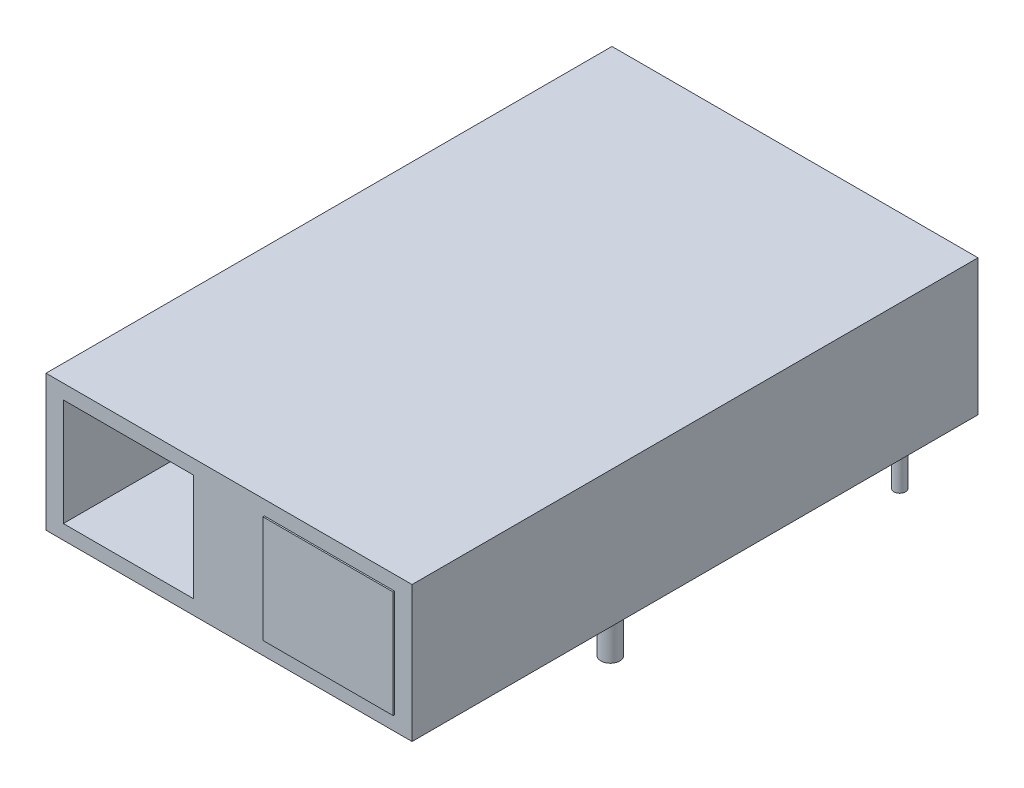
ISO-10303-21;
HEADER;
FILE_DESCRIPTION(('STEP AP214'),'2;1');
FILE_NAME('part.step','',(''),(''),'','','');
FILE_SCHEMA(('AUTOMOTIVE_DESIGN { 1 0 10303 214 1 1 1 1 }'));
ENDSEC;
DATA;
#1=APPLICATION_CONTEXT('core data for automotive mechanical design processes');
#2=APPLICATION_PROTOCOL_DEFINITION('international standard','automotive_design',2000,#1);
#3=PRODUCT_CONTEXT('',#1,'mechanical');
#4=PRODUCT('Part','Part','',(#3));
#5=PRODUCT_RELATED_PRODUCT_CATEGORY('part','',(#4));
#6=PRODUCT_DEFINITION_FORMATION('','',#4);
#7=PRODUCT_DEFINITION_CONTEXT('part definition',#1,'design');
#8=PRODUCT_DEFINITION('design','',#6,#7);
#9=PRODUCT_DEFINITION_SHAPE('','',#8);
#10=(LENGTH_UNIT() NAMED_UNIT(*) SI_UNIT(.MILLI.,.METRE.));
#11=(NAMED_UNIT(*) PLANE_ANGLE_UNIT() SI_UNIT($,.RADIAN.));
#12=(NAMED_UNIT(*) SI_UNIT($,.STERADIAN.) SOLID_ANGLE_UNIT());
#13=UNCERTAINTY_MEASURE_WITH_UNIT(LENGTH_MEASURE(1.E-05),#10,'distance_accuracy_value','');
#14=(GEOMETRIC_REPRESENTATION_CONTEXT(3) GLOBAL_UNCERTAINTY_ASSIGNED_CONTEXT((#13)) GLOBAL_UNIT_ASSIGNED_CONTEXT((#10,
#11,#12)) REPRESENTATION_CONTEXT('',''));
#15=CARTESIAN_POINT('',(0.,0.,0.));
#16=DIRECTION('',(0.,0.,1.));
#17=DIRECTION('',(1.,0.,0.));
#18=AXIS2_PLACEMENT_3D('',#15,#16,#17);
#19=CARTESIAN_POINT('',(0.,-4.7,0.));
#20=DIRECTION('',(0.,1.,0.));
#21=DIRECTION('',(0.,0.,1.));
#22=AXIS2_PLACEMENT_3D('',#19,#20,#21);
#23=PLANE('',#22);
#24=DIRECTION('',(0.,0.,1.));
#25=VECTOR('',#24,1.);
#26=CARTESIAN_POINT('',(-12.65,-4.7,-19.56));
#27=LINE('',#26,#25);
#28=CARTESIAN_POINT('',(-12.65,-4.7,-19.56));
#29=VERTEX_POINT('',#28);
#30=CARTESIAN_POINT('',(-12.65,-4.7,19.56));
#31=VERTEX_POINT('',#30);
#32=EDGE_CURVE('E195',#29,#31,#27,.T.);
#33=ORIENTED_EDGE('',*,*,#32,.F.);
#34=DIRECTION('',(-1.,0.,0.));
#35=VECTOR('',#34,1.);
#36=CARTESIAN_POINT('',(-12.65,-4.7,-19.56));
#37=LINE('',#36,#35);
#38=CARTESIAN_POINT('',(12.65,-4.7,-19.56));
#39=VERTEX_POINT('',#38);
#40=EDGE_CURVE('E204',#39,#29,#37,.T.);
#41=ORIENTED_EDGE('',*,*,#40,.F.);
#42=DIRECTION('',(0.,0.,-1.));
#43=VECTOR('',#42,1.);
#44=CARTESIAN_POINT('',(12.65,-4.7,-19.56));
#45=LINE('',#44,#43);
#46=CARTESIAN_POINT('',(12.65,-4.7,19.56));
#47=VERTEX_POINT('',#46);
#48=EDGE_CURVE('E201',#47,#39,#45,.T.);
#49=ORIENTED_EDGE('',*,*,#48,.F.);
#50=DIRECTION('',(1.,0.,0.));
#51=VECTOR('',#50,1.);
#52=CARTESIAN_POINT('',(-12.65,-4.7,19.56));
#53=LINE('',#52,#51);
#54=EDGE_CURVE('E198',#31,#47,#53,.T.);
#55=ORIENTED_EDGE('',*,*,#54,.F.);
#56=EDGE_LOOP('',(#33,#41,#49,#55));
#57=FACE_BOUND('',#56,.T.);
#58=CARTESIAN_POINT('',(-10.16,-4.7,3.35999999999999));
#59=DIRECTION('',(0.,1.,0.));
#60=DIRECTION('',(0.,0.,1.));
#61=AXIS2_PLACEMENT_3D('',#58,#59,#60);
#62=CIRCLE('',#61,0.649999999999999);
#63=CARTESIAN_POINT('',(-10.16,-4.7,4.00999999999999));
#64=VERTEX_POINT('',#63);
#65=EDGE_CURVE('E210',#64,#64,#62,.F.);
#66=ORIENTED_EDGE('',*,*,#65,.F.);
#67=EDGE_LOOP('',(#66));
#68=FACE_BOUND('',#67,.T.);
#69=CARTESIAN_POINT('',(10.16,-4.7,3.35999999999999));
#70=DIRECTION('',(0.,1.,0.));
#71=DIRECTION('',(0.,0.,1.));
#72=AXIS2_PLACEMENT_3D('',#69,#70,#71);
#73=CIRCLE('',#72,0.649999999999999);
#74=CARTESIAN_POINT('',(10.16,-4.7,4.00999999999999));
#75=VERTEX_POINT('',#74);
#76=EDGE_CURVE('E218',#75,#75,#73,.F.);
#77=ORIENTED_EDGE('',*,*,#76,.F.);
#78=EDGE_LOOP('',(#77));
#79=FACE_BOUND('',#78,.T.);
#80=CARTESIAN_POINT('',(-10.16,-4.7,-16.64));
#81=DIRECTION('',(0.,1.,0.));
#82=DIRECTION('',(0.,0.,1.));
#83=AXIS2_PLACEMENT_3D('',#80,#81,#82);
#84=CIRCLE('',#83,0.4);
#85=CARTESIAN_POINT('',(-10.16,-4.7,-16.24));
#86=VERTEX_POINT('',#85);
#87=EDGE_CURVE('E221',#86,#86,#84,.F.);
#88=ORIENTED_EDGE('',*,*,#87,.F.);
#89=EDGE_LOOP('',(#88));
#90=FACE_BOUND('',#89,.T.);
#91=CARTESIAN_POINT('',(-7.62,-4.7,-16.64));
#92=DIRECTION('',(0.,1.,0.));
#93=DIRECTION('',(0.,0.,1.));
#94=AXIS2_PLACEMENT_3D('',#91,#92,#93);
#95=CIRCLE('',#94,0.4);
#96=CARTESIAN_POINT('',(-7.62,-4.7,-16.24));
#97=VERTEX_POINT('',#96);
#98=EDGE_CURVE('E224',#97,#97,#95,.F.);
#99=ORIENTED_EDGE('',*,*,#98,.F.);
#100=EDGE_LOOP('',(#99));
#101=FACE_BOUND('',#100,.T.);
#102=CARTESIAN_POINT('',(-5.08,-4.7,-16.64));
#103=DIRECTION('',(0.,1.,0.));
#104=DIRECTION('',(0.,0.,1.));
#105=AXIS2_PLACEMENT_3D('',#102,#103,#104);
#106=CIRCLE('',#105,0.4);
#107=CARTESIAN_POINT('',(-5.08,-4.7,-16.24));
#108=VERTEX_POINT('',#107);
#109=EDGE_CURVE('E227',#108,#108,#106,.F.);
#110=ORIENTED_EDGE('',*,*,#109,.F.);
#111=EDGE_LOOP('',(#110));
#112=FACE_BOUND('',#111,.T.);
#113=CARTESIAN_POINT('',(-2.54,-4.7,-16.64));
#114=DIRECTION('',(0.,1.,0.));
#115=DIRECTION('',(0.,0.,1.));
#116=AXIS2_PLACEMENT_3D('',#113,#114,#115);
#117=CIRCLE('',#116,0.4);
#118=CARTESIAN_POINT('',(-2.54,-4.7,-16.24));
#119=VERTEX_POINT('',#118);
#120=EDGE_CURVE('E230',#119,#119,#117,.F.);
#121=ORIENTED_EDGE('',*,*,#120,.F.);
#122=EDGE_LOOP('',(#121));
#123=FACE_BOUND('',#122,.T.);
#124=CARTESIAN_POINT('',(0.,-4.7,-16.64));
#125=DIRECTION('',(0.,1.,0.));
#126=DIRECTION('',(0.,0.,1.));
#127=AXIS2_PLACEMENT_3D('',#124,#125,#126);
#128=CIRCLE('',#127,0.399999999999999);
#129=CARTESIAN_POINT('',(0.,-4.7,-16.24));
#130=VERTEX_POINT('',#129);
#131=EDGE_CURVE('E233',#130,#130,#128,.F.);
#132=ORIENTED_EDGE('',*,*,#131,.F.);
#133=EDGE_LOOP('',(#132));
#134=FACE_BOUND('',#133,.T.);
#135=CARTESIAN_POINT('',(2.54,-4.7,-16.64));
#136=DIRECTION('',(0.,1.,0.));
#137=DIRECTION('',(0.,0.,1.));
#138=AXIS2_PLACEMENT_3D('',#135,#136,#137);
#139=CIRCLE('',#138,0.4);
#140=CARTESIAN_POINT('',(2.54,-4.7,-16.24));
#141=VERTEX_POINT('',#140);
#142=EDGE_CURVE('E236',#141,#141,#139,.F.);
#143=ORIENTED_EDGE('',*,*,#142,.F.);
#144=EDGE_LOOP('',(#143));
#145=FACE_BOUND('',#144,.T.);
#146=CARTESIAN_POINT('',(5.08,-4.7,-16.64));
#147=DIRECTION('',(0.,1.,0.));
#148=DIRECTION('',(0.,0.,1.));
#149=AXIS2_PLACEMENT_3D('',#146,#147,#148);
#150=CIRCLE('',#149,0.4);
#151=CARTESIAN_POINT('',(5.08,-4.7,-16.24));
#152=VERTEX_POINT('',#151);
#153=EDGE_CURVE('E239',#152,#152,#150,.F.);
#154=ORIENTED_EDGE('',*,*,#153,.F.);
#155=EDGE_LOOP('',(#154));
#156=FACE_BOUND('',#155,.T.);
#157=CARTESIAN_POINT('',(7.62,-4.7,-16.64));
#158=DIRECTION('',(0.,1.,0.));
#159=DIRECTION('',(0.,0.,1.));
#160=AXIS2_PLACEMENT_3D('',#157,#158,#159);
#161=CIRCLE('',#160,0.4);
#162=CARTESIAN_POINT('',(7.62,-4.7,-16.24));
#163=VERTEX_POINT('',#162);
#164=EDGE_CURVE('E43',#163,#163,#161,.F.);
#165=ORIENTED_EDGE('',*,*,#164,.F.);
#166=EDGE_LOOP('',(#165));
#167=FACE_BOUND('',#166,.T.);
#168=CARTESIAN_POINT('',(10.16,-4.7,-16.64));
#169=DIRECTION('',(0.,1.,0.));
#170=DIRECTION('',(0.,0.,1.));
#171=AXIS2_PLACEMENT_3D('',#168,#169,#170);
#172=CIRCLE('',#171,0.4);
#173=CARTESIAN_POINT('',(10.16,-4.7,-16.24));
#174=VERTEX_POINT('',#173);
#175=EDGE_CURVE('E11',#174,#174,#172,.F.);
#176=ORIENTED_EDGE('',*,*,#175,.F.);
#177=EDGE_LOOP('',(#176));
#178=FACE_BOUND('',#177,.T.);
#179=ADVANCED_FACE('F35',(#57,#68,#79,#90,#101,#112,#123,#134,#145,#156,#167,#178),#23,.F.);
#180=CARTESIAN_POINT('',(-12.65,-4.7,19.56));
#181=DIRECTION('',(0.,0.,1.));
#182=DIRECTION('',(1.,0.,0.));
#183=AXIS2_PLACEMENT_3D('',#180,#181,#182);
#184=PLANE('',#183);
#185=DIRECTION('',(0.,-1.,0.));
#186=VECTOR('',#185,1.);
#187=CARTESIAN_POINT('',(-11.45,3.7,19.56));
#188=LINE('',#187,#186);
#189=CARTESIAN_POINT('',(-11.45,3.7,19.56));
#190=VERTEX_POINT('',#189);
#191=CARTESIAN_POINT('',(-11.45,-3.7,19.56));
#192=VERTEX_POINT('',#191);
#193=EDGE_CURVE('E58',#190,#192,#188,.T.);
#194=ORIENTED_EDGE('',*,*,#193,.F.);
#195=DIRECTION('',(-1.,0.,0.));
#196=VECTOR('',#195,1.);
#197=CARTESIAN_POINT('',(-11.45,3.7,19.56));
#198=LINE('',#197,#196);
#199=CARTESIAN_POINT('',(-2.45,3.7,19.56));
#200=VERTEX_POINT('',#199);
#201=EDGE_CURVE('E159',#200,#190,#198,.T.);
#202=ORIENTED_EDGE('',*,*,#201,.F.);
#203=DIRECTION('',(0.,1.,0.));
#204=VECTOR('',#203,1.);
#205=CARTESIAN_POINT('',(-2.45,3.7,19.56));
#206=LINE('',#205,#204);
#207=CARTESIAN_POINT('',(-2.45,-3.7,19.56));
#208=VERTEX_POINT('',#207);
#209=EDGE_CURVE('E171',#208,#200,#206,.T.);
#210=ORIENTED_EDGE('',*,*,#209,.F.);
#211=DIRECTION('',(1.,0.,0.));
#212=VECTOR('',#211,1.);
#213=CARTESIAN_POINT('',(-11.45,-3.7,19.56));
#214=LINE('',#213,#212);
#215=EDGE_CURVE('E150',#192,#208,#214,.T.);
#216=ORIENTED_EDGE('',*,*,#215,.F.);
#217=EDGE_LOOP('',(#194,#202,#210,#216));
#218=FACE_BOUND('',#217,.T.);
#219=DIRECTION('',(0.,1.,0.));
#220=VECTOR('',#219,1.);
#221=CARTESIAN_POINT('',(12.65,-4.7,19.56));
#222=LINE('',#221,#220);
#223=CARTESIAN_POINT('',(12.65,4.7,19.56));
#224=VERTEX_POINT('',#223);
#225=EDGE_CURVE('E213',#47,#224,#222,.T.);
#226=ORIENTED_EDGE('',*,*,#225,.T.);
#227=DIRECTION('',(1.,0.,0.));
#228=VECTOR('',#227,1.);
#229=CARTESIAN_POINT('',(-12.65,4.7,19.56));
#230=LINE('',#229,#228);
#231=CARTESIAN_POINT('',(-12.65,4.7,19.56));
#232=VERTEX_POINT('',#231);
#233=EDGE_CURVE('E186',#232,#224,#230,.T.);
#234=ORIENTED_EDGE('',*,*,#233,.F.);
#235=DIRECTION('',(0.,1.,0.));
#236=VECTOR('',#235,1.);
#237=CARTESIAN_POINT('',(-12.65,-4.7,19.56));
#238=LINE('',#237,#236);
#239=EDGE_CURVE('E207',#31,#232,#238,.T.);
#240=ORIENTED_EDGE('',*,*,#239,.F.);
#241=ORIENTED_EDGE('',*,*,#54,.T.);
#242=EDGE_LOOP('',(#226,#234,#240,#241));
#243=FACE_BOUND('',#242,.T.);
#244=DIRECTION('',(1.,0.,0.));
#245=VECTOR('',#244,1.);
#246=CARTESIAN_POINT('',(2.45000000000002,-3.7,19.56));
#247=LINE('',#246,#245);
#248=CARTESIAN_POINT('',(2.45000000000002,-3.7,19.56));
#249=VERTEX_POINT('',#248);
#250=CARTESIAN_POINT('',(11.45,-3.7,19.56));
#251=VERTEX_POINT('',#250);
#252=EDGE_CURVE('E399',#249,#251,#247,.T.);
#253=ORIENTED_EDGE('',*,*,#252,.F.);
#254=DIRECTION('',(0.,-1.,0.));
#255=VECTOR('',#254,1.);
#256=CARTESIAN_POINT('',(2.45000000000002,3.7,19.56));
#257=LINE('',#256,#255);
#258=CARTESIAN_POINT('',(2.45000000000002,3.7,19.56));
#259=VERTEX_POINT('',#258);
#260=EDGE_CURVE('E147',#259,#249,#257,.T.);
#261=ORIENTED_EDGE('',*,*,#260,.F.);
#262=DIRECTION('',(-1.,0.,0.));
#263=VECTOR('',#262,1.);
#264=CARTESIAN_POINT('',(2.45000000000002,3.7,19.56));
#265=LINE('',#264,#263);
#266=CARTESIAN_POINT('',(11.45,3.7,19.56));
#267=VERTEX_POINT('',#266);
#268=EDGE_CURVE('E143',#267,#259,#265,.T.);
#269=ORIENTED_EDGE('',*,*,#268,.F.);
#270=DIRECTION('',(0.,1.,0.));
#271=VECTOR('',#270,1.);
#272=CARTESIAN_POINT('',(11.45,3.7,19.56));
#273=LINE('',#272,#271);
#274=EDGE_CURVE('E401',#251,#267,#273,.T.);
#275=ORIENTED_EDGE('',*,*,#274,.F.);
#276=EDGE_LOOP('',(#253,#261,#269,#275));
#277=FACE_BOUND('',#276,.T.);
#278=ADVANCED_FACE('F248',(#218,#243,#277),#184,.T.);
#279=CARTESIAN_POINT('',(-12.65,-4.7,-19.56));
#280=DIRECTION('',(-1.,0.,0.));
#281=DIRECTION('',(0.,0.,1.));
#282=AXIS2_PLACEMENT_3D('',#279,#280,#281);
#283=PLANE('',#282);
#284=ORIENTED_EDGE('',*,*,#239,.T.);
#285=DIRECTION('',(0.,0.,1.));
#286=VECTOR('',#285,1.);
#287=CARTESIAN_POINT('',(-12.65,4.7,-19.56));
#288=LINE('',#287,#286);
#289=CARTESIAN_POINT('',(-12.65,4.7,-19.56));
#290=VERTEX_POINT('',#289);
#291=EDGE_CURVE('E178',#290,#232,#288,.T.);
#292=ORIENTED_EDGE('',*,*,#291,.F.);
#293=DIRECTION('',(0.,1.,0.));
#294=VECTOR('',#293,1.);
#295=CARTESIAN_POINT('',(-12.65,-4.7,-19.56));
#296=LINE('',#295,#294);
#297=EDGE_CURVE('E208',#29,#290,#296,.T.);
#298=ORIENTED_EDGE('',*,*,#297,.F.);
#299=ORIENTED_EDGE('',*,*,#32,.T.);
#300=EDGE_LOOP('',(#284,#292,#298,#299));
#301=FACE_BOUND('',#300,.T.);
#302=ADVANCED_FACE('F37',(#301),#283,.T.);
#303=CARTESIAN_POINT('',(-12.65,-4.7,-19.56));
#304=DIRECTION('',(0.,0.,-1.));
#305=DIRECTION('',(-1.,0.,0.));
#306=AXIS2_PLACEMENT_3D('',#303,#304,#305);
#307=PLANE('',#306);
#308=ORIENTED_EDGE('',*,*,#297,.T.);
#309=DIRECTION('',(-1.,0.,0.));
#310=VECTOR('',#309,1.);
#311=CARTESIAN_POINT('',(-12.65,4.7,-19.56));
#312=LINE('',#311,#310);
#313=CARTESIAN_POINT('',(12.65,4.7,-19.56));
#314=VERTEX_POINT('',#313);
#315=EDGE_CURVE('E192',#314,#290,#312,.T.);
#316=ORIENTED_EDGE('',*,*,#315,.F.);
#317=DIRECTION('',(0.,1.,0.));
#318=VECTOR('',#317,1.);
#319=CARTESIAN_POINT('',(12.65,-4.7,-19.56));
#320=LINE('',#319,#318);
#321=EDGE_CURVE('E211',#39,#314,#320,.T.);
#322=ORIENTED_EDGE('',*,*,#321,.F.);
#323=ORIENTED_EDGE('',*,*,#40,.T.);
#324=EDGE_LOOP('',(#308,#316,#322,#323));
#325=FACE_BOUND('',#324,.T.);
#326=ADVANCED_FACE('F381',(#325),#307,.T.);
#327=CARTESIAN_POINT('',(12.65,-4.7,-19.56));
#328=DIRECTION('',(1.,0.,0.));
#329=DIRECTION('',(0.,0.,-1.));
#330=AXIS2_PLACEMENT_3D('',#327,#328,#329);
#331=PLANE('',#330);
#332=ORIENTED_EDGE('',*,*,#321,.T.);
#333=DIRECTION('',(0.,0.,-1.));
#334=VECTOR('',#333,1.);
#335=CARTESIAN_POINT('',(12.65,4.7,-19.56));
#336=LINE('',#335,#334);
#337=EDGE_CURVE('E189',#224,#314,#336,.T.);
#338=ORIENTED_EDGE('',*,*,#337,.F.);
#339=ORIENTED_EDGE('',*,*,#225,.F.);
#340=ORIENTED_EDGE('',*,*,#48,.T.);
#341=EDGE_LOOP('',(#332,#338,#339,#340));
#342=FACE_BOUND('',#341,.T.);
#343=ADVANCED_FACE('F378',(#342),#331,.T.);
#344=CARTESIAN_POINT('',(0.,4.7,0.));
#345=DIRECTION('',(0.,1.,0.));
#346=DIRECTION('',(0.,0.,1.));
#347=AXIS2_PLACEMENT_3D('',#344,#345,#346);
#348=PLANE('',#347);
#349=ORIENTED_EDGE('',*,*,#291,.T.);
#350=ORIENTED_EDGE('',*,*,#233,.T.);
#351=ORIENTED_EDGE('',*,*,#337,.T.);
#352=ORIENTED_EDGE('',*,*,#315,.T.);
#353=EDGE_LOOP('',(#349,#350,#351,#352));
#354=FACE_BOUND('',#353,.T.);
#355=ADVANCED_FACE('F376',(#354),#348,.T.);
#356=CARTESIAN_POINT('',(-11.45,3.7,9.56));
#357=DIRECTION('',(-1.,0.,0.));
#358=DIRECTION('',(0.,-1.,0.));
#359=AXIS2_PLACEMENT_3D('',#356,#357,#358);
#360=PLANE('',#359);
#361=ORIENTED_EDGE('',*,*,#193,.T.);
#362=DIRECTION('',(0.,0.,1.));
#363=VECTOR('',#362,1.);
#364=CARTESIAN_POINT('',(-11.45,-3.7,9.56));
#365=LINE('',#364,#363);
#366=CARTESIAN_POINT('',(-11.45,-3.7,9.56));
#367=VERTEX_POINT('',#366);
#368=EDGE_CURVE('E167',#367,#192,#365,.T.);
#369=ORIENTED_EDGE('',*,*,#368,.F.);
#370=DIRECTION('',(0.,-1.,0.));
#371=VECTOR('',#370,1.);
#372=CARTESIAN_POINT('',(-11.45,3.7,9.56));
#373=LINE('',#372,#371);
#374=CARTESIAN_POINT('',(-11.45,3.7,9.56));
#375=VERTEX_POINT('',#374);
#376=EDGE_CURVE('E155',#375,#367,#373,.T.);
#377=ORIENTED_EDGE('',*,*,#376,.F.);
#378=DIRECTION('',(0.,0.,1.));
#379=VECTOR('',#378,1.);
#380=CARTESIAN_POINT('',(-11.45,3.7,9.56));
#381=LINE('',#380,#379);
#382=EDGE_CURVE('E176',#375,#190,#381,.T.);
#383=ORIENTED_EDGE('',*,*,#382,.T.);
#384=EDGE_LOOP('',(#361,#369,#377,#383));
#385=FACE_BOUND('',#384,.T.);
#386=ADVANCED_FACE('F366',(#385),#360,.F.);
#387=CARTESIAN_POINT('',(-11.45,3.7,9.56));
#388=DIRECTION('',(0.,1.,0.));
#389=DIRECTION('',(-1.,0.,0.));
#390=AXIS2_PLACEMENT_3D('',#387,#388,#389);
#391=PLANE('',#390);
#392=ORIENTED_EDGE('',*,*,#201,.T.);
#393=ORIENTED_EDGE('',*,*,#382,.F.);
#394=DIRECTION('',(-1.,0.,0.));
#395=VECTOR('',#394,1.);
#396=CARTESIAN_POINT('',(-11.45,3.7,9.56));
#397=LINE('',#396,#395);
#398=CARTESIAN_POINT('',(-2.45,3.7,9.56));
#399=VERTEX_POINT('',#398);
#400=EDGE_CURVE('E165',#399,#375,#397,.T.);
#401=ORIENTED_EDGE('',*,*,#400,.F.);
#402=DIRECTION('',(0.,0.,1.));
#403=VECTOR('',#402,1.);
#404=CARTESIAN_POINT('',(-2.45,3.7,9.56));
#405=LINE('',#404,#403);
#406=EDGE_CURVE('E179',#399,#200,#405,.T.);
#407=ORIENTED_EDGE('',*,*,#406,.T.);
#408=EDGE_LOOP('',(#392,#393,#401,#407));
#409=FACE_BOUND('',#408,.T.);
#410=ADVANCED_FACE('F362',(#409),#391,.F.);
#411=CARTESIAN_POINT('',(-2.45,3.7,9.56));
#412=DIRECTION('',(1.,0.,0.));
#413=DIRECTION('',(0.,1.,0.));
#414=AXIS2_PLACEMENT_3D('',#411,#412,#413);
#415=PLANE('',#414);
#416=ORIENTED_EDGE('',*,*,#209,.T.);
#417=ORIENTED_EDGE('',*,*,#406,.F.);
#418=DIRECTION('',(0.,1.,0.));
#419=VECTOR('',#418,1.);
#420=CARTESIAN_POINT('',(-2.45,3.7,9.56));
#421=LINE('',#420,#419);
#422=CARTESIAN_POINT('',(-2.45,-3.7,9.56));
#423=VERTEX_POINT('',#422);
#424=EDGE_CURVE('E162',#423,#399,#421,.T.);
#425=ORIENTED_EDGE('',*,*,#424,.F.);
#426=DIRECTION('',(0.,0.,1.));
#427=VECTOR('',#426,1.);
#428=CARTESIAN_POINT('',(-2.45,-3.7,9.56));
#429=LINE('',#428,#427);
#430=EDGE_CURVE('E181',#423,#208,#429,.T.);
#431=ORIENTED_EDGE('',*,*,#430,.T.);
#432=EDGE_LOOP('',(#416,#417,#425,#431));
#433=FACE_BOUND('',#432,.T.);
#434=ADVANCED_FACE('F365',(#433),#415,.F.);
#435=CARTESIAN_POINT('',(-11.45,-3.7,9.56));
#436=DIRECTION('',(0.,-1.,0.));
#437=DIRECTION('',(1.,0.,0.));
#438=AXIS2_PLACEMENT_3D('',#435,#436,#437);
#439=PLANE('',#438);
#440=ORIENTED_EDGE('',*,*,#215,.T.);
#441=ORIENTED_EDGE('',*,*,#430,.F.);
#442=DIRECTION('',(1.,0.,0.));
#443=VECTOR('',#442,1.);
#444=CARTESIAN_POINT('',(-11.45,-3.7,9.56));
#445=LINE('',#444,#443);
#446=EDGE_CURVE('E158',#367,#423,#445,.T.);
#447=ORIENTED_EDGE('',*,*,#446,.F.);
#448=ORIENTED_EDGE('',*,*,#368,.T.);
#449=EDGE_LOOP('',(#440,#441,#447,#448));
#450=FACE_BOUND('',#449,.T.);
#451=ADVANCED_FACE('F360',(#450),#439,.F.);
#452=CARTESIAN_POINT('',(0.,0.,9.56));
#453=DIRECTION('',(0.,0.,1.));
#454=DIRECTION('',(1.,0.,0.));
#455=AXIS2_PLACEMENT_3D('',#452,#453,#454);
#456=PLANE('',#455);
#457=ORIENTED_EDGE('',*,*,#376,.T.);
#458=ORIENTED_EDGE('',*,*,#446,.T.);
#459=ORIENTED_EDGE('',*,*,#424,.T.);
#460=ORIENTED_EDGE('',*,*,#400,.T.);
#461=EDGE_LOOP('',(#457,#458,#459,#460));
#462=FACE_BOUND('',#461,.T.);
#463=ADVANCED_FACE('F357',(#462),#456,.T.);
#464=CARTESIAN_POINT('',(2.45000000000002,3.7,19.66));
#465=DIRECTION('',(1.,0.,0.));
#466=DIRECTION('',(0.,0.,-1.));
#467=AXIS2_PLACEMENT_3D('',#464,#465,#466);
#468=PLANE('',#467);
#469=ORIENTED_EDGE('',*,*,#260,.T.);
#470=DIRECTION('',(0.,0.,-1.));
#471=VECTOR('',#470,1.);
#472=CARTESIAN_POINT('',(2.45000000000002,-3.7,19.66));
#473=LINE('',#472,#471);
#474=CARTESIAN_POINT('',(2.45000000000002,-3.7,19.66));
#475=VERTEX_POINT('',#474);
#476=EDGE_CURVE('E128',#475,#249,#473,.T.);
#477=ORIENTED_EDGE('',*,*,#476,.F.);
#478=DIRECTION('',(0.,-1.,0.));
#479=VECTOR('',#478,1.);
#480=CARTESIAN_POINT('',(2.45000000000002,3.7,19.66));
#481=LINE('',#480,#479);
#482=CARTESIAN_POINT('',(2.45000000000002,3.7,19.66));
#483=VERTEX_POINT('',#482);
#484=EDGE_CURVE('E135',#483,#475,#481,.T.);
#485=ORIENTED_EDGE('',*,*,#484,.F.);
#486=DIRECTION('',(0.,0.,-1.));
#487=VECTOR('',#486,1.);
#488=CARTESIAN_POINT('',(2.45000000000002,3.7,19.66));
#489=LINE('',#488,#487);
#490=EDGE_CURVE('E409',#483,#259,#489,.T.);
#491=ORIENTED_EDGE('',*,*,#490,.T.);
#492=EDGE_LOOP('',(#469,#477,#485,#491));
#493=FACE_BOUND('',#492,.T.);
#494=ADVANCED_FACE('F145',(#493),#468,.F.);
#495=CARTESIAN_POINT('',(2.45000000000002,-3.7,19.66));
#496=DIRECTION('',(0.,1.,0.));
#497=DIRECTION('',(0.,0.,1.));
#498=AXIS2_PLACEMENT_3D('',#495,#496,#497);
#499=PLANE('',#498);
#500=ORIENTED_EDGE('',*,*,#252,.T.);
#501=DIRECTION('',(0.,0.,-1.));
#502=VECTOR('',#501,1.);
#503=CARTESIAN_POINT('',(11.45,-3.7,19.66));
#504=LINE('',#503,#502);
#505=CARTESIAN_POINT('',(11.45,-3.7,19.66));
#506=VERTEX_POINT('',#505);
#507=EDGE_CURVE('E131',#506,#251,#504,.T.);
#508=ORIENTED_EDGE('',*,*,#507,.F.);
#509=DIRECTION('',(1.,0.,0.));
#510=VECTOR('',#509,1.);
#511=CARTESIAN_POINT('',(2.45000000000002,-3.7,19.66));
#512=LINE('',#511,#510);
#513=EDGE_CURVE('E124',#475,#506,#512,.T.);
#514=ORIENTED_EDGE('',*,*,#513,.F.);
#515=ORIENTED_EDGE('',*,*,#476,.T.);
#516=EDGE_LOOP('',(#500,#508,#514,#515));
#517=FACE_BOUND('',#516,.T.);
#518=ADVANCED_FACE('F126',(#517),#499,.F.);
#519=CARTESIAN_POINT('',(11.45,3.7,19.66));
#520=DIRECTION('',(-1.,0.,0.));
#521=DIRECTION('',(0.,0.,1.));
#522=AXIS2_PLACEMENT_3D('',#519,#520,#521);
#523=PLANE('',#522);
#524=ORIENTED_EDGE('',*,*,#274,.T.);
#525=DIRECTION('',(0.,0.,-1.));
#526=VECTOR('',#525,1.);
#527=CARTESIAN_POINT('',(11.45,3.7,19.66));
#528=LINE('',#527,#526);
#529=CARTESIAN_POINT('',(11.45,3.7,19.66));
#530=VERTEX_POINT('',#529);
#531=EDGE_CURVE('E50',#530,#267,#528,.T.);
#532=ORIENTED_EDGE('',*,*,#531,.F.);
#533=DIRECTION('',(0.,1.,0.));
#534=VECTOR('',#533,1.);
#535=CARTESIAN_POINT('',(11.45,3.7,19.66));
#536=LINE('',#535,#534);
#537=EDGE_CURVE('E134',#506,#530,#536,.T.);
#538=ORIENTED_EDGE('',*,*,#537,.F.);
#539=ORIENTED_EDGE('',*,*,#507,.T.);
#540=EDGE_LOOP('',(#524,#532,#538,#539));
#541=FACE_BOUND('',#540,.T.);
#542=ADVANCED_FACE('F349',(#541),#523,.F.);
#543=CARTESIAN_POINT('',(2.45000000000002,3.7,19.66));
#544=DIRECTION('',(0.,-1.,0.));
#545=DIRECTION('',(0.,0.,-1.));
#546=AXIS2_PLACEMENT_3D('',#543,#544,#545);
#547=PLANE('',#546);
#548=ORIENTED_EDGE('',*,*,#268,.T.);
#549=ORIENTED_EDGE('',*,*,#490,.F.);
#550=DIRECTION('',(-1.,0.,0.));
#551=VECTOR('',#550,1.);
#552=CARTESIAN_POINT('',(2.45000000000002,3.7,19.66));
#553=LINE('',#552,#551);
#554=EDGE_CURVE('E139',#530,#483,#553,.T.);
#555=ORIENTED_EDGE('',*,*,#554,.F.);
#556=ORIENTED_EDGE('',*,*,#531,.T.);
#557=EDGE_LOOP('',(#548,#549,#555,#556));
#558=FACE_BOUND('',#557,.T.);
#559=ADVANCED_FACE('F346',(#558),#547,.F.);
#560=CARTESIAN_POINT('',(0.,0.,19.66));
#561=DIRECTION('',(0.,0.,1.));
#562=DIRECTION('',(1.,0.,0.));
#563=AXIS2_PLACEMENT_3D('',#560,#561,#562);
#564=PLANE('',#563);
#565=ORIENTED_EDGE('',*,*,#484,.T.);
#566=ORIENTED_EDGE('',*,*,#513,.T.);
#567=ORIENTED_EDGE('',*,*,#537,.T.);
#568=ORIENTED_EDGE('',*,*,#554,.T.);
#569=EDGE_LOOP('',(#565,#566,#567,#568));
#570=FACE_BOUND('',#569,.T.);
#571=ADVANCED_FACE('F138',(#570),#564,.T.);
#572=CARTESIAN_POINT('',(-10.16,-8.9,3.35999999999999));
#573=DIRECTION('',(0.,1.,0.));
#574=DIRECTION('',(0.,0.,1.));
#575=AXIS2_PLACEMENT_3D('',#572,#573,#574);
#576=CYLINDRICAL_SURFACE('',#575,0.649999999999999);
#577=CARTESIAN_POINT('',(-10.16,-8.9,3.35999999999999));
#578=DIRECTION('',(0.,-1.,0.));
#579=DIRECTION('',(0.,0.,-1.));
#580=AXIS2_PLACEMENT_3D('',#577,#578,#579);
#581=CIRCLE('',#580,0.649999999999999);
#582=CARTESIAN_POINT('',(-10.16,-8.9,2.71));
#583=VERTEX_POINT('',#582);
#584=EDGE_CURVE('E404',#583,#583,#581,.T.);
#585=ORIENTED_EDGE('',*,*,#584,.F.);
#586=EDGE_LOOP('',(#585));
#587=FACE_BOUND('',#586,.T.);
#588=ORIENTED_EDGE('',*,*,#65,.T.);
#589=EDGE_LOOP('',(#588));
#590=FACE_BOUND('',#589,.T.);
#591=ADVANCED_FACE('F339',(#587,#590),#576,.T.);
#592=CARTESIAN_POINT('',(-10.16,-8.9,3.35999999999999));
#593=DIRECTION('',(0.,-1.,0.));
#594=DIRECTION('',(0.,0.,-1.));
#595=AXIS2_PLACEMENT_3D('',#592,#593,#594);
#596=PLANE('',#595);
#597=ORIENTED_EDGE('',*,*,#584,.T.);
#598=EDGE_LOOP('',(#597));
#599=FACE_BOUND('',#598,.T.);
#600=ADVANCED_FACE('F335',(#599),#596,.T.);
#601=CARTESIAN_POINT('',(10.16,-8.9,3.35999999999999));
#602=DIRECTION('',(0.,1.,0.));
#603=DIRECTION('',(0.,0.,1.));
#604=AXIS2_PLACEMENT_3D('',#601,#602,#603);
#605=CYLINDRICAL_SURFACE('',#604,0.649999999999999);
#606=CARTESIAN_POINT('',(10.16,-8.9,3.35999999999999));
#607=DIRECTION('',(0.,-1.,0.));
#608=DIRECTION('',(0.,0.,1.));
#609=AXIS2_PLACEMENT_3D('',#606,#607,#608);
#610=CIRCLE('',#609,0.649999999999999);
#611=CARTESIAN_POINT('',(10.16,-8.9,4.00999999999999));
#612=VERTEX_POINT('',#611);
#613=EDGE_CURVE('E414',#612,#612,#610,.T.);
#614=ORIENTED_EDGE('',*,*,#613,.F.);
#615=EDGE_LOOP('',(#614));
#616=FACE_BOUND('',#615,.T.);
#617=ORIENTED_EDGE('',*,*,#76,.T.);
#618=EDGE_LOOP('',(#617));
#619=FACE_BOUND('',#618,.T.);
#620=ADVANCED_FACE('F331',(#616,#619),#605,.T.);
#621=CARTESIAN_POINT('',(10.16,-8.9,3.35999999999999));
#622=DIRECTION('',(0.,1.,0.));
#623=DIRECTION('',(0.,0.,1.));
#624=AXIS2_PLACEMENT_3D('',#621,#622,#623);
#625=PLANE('',#624);
#626=ORIENTED_EDGE('',*,*,#613,.T.);
#627=EDGE_LOOP('',(#626));
#628=FACE_BOUND('',#627,.T.);
#629=ADVANCED_FACE('F327',(#628),#625,.F.);
#630=CARTESIAN_POINT('',(-10.16,-8.9,-16.64));
#631=DIRECTION('',(0.,1.,0.));
#632=DIRECTION('',(0.,0.,1.));
#633=AXIS2_PLACEMENT_3D('',#630,#631,#632);
#634=CYLINDRICAL_SURFACE('',#633,0.4);
#635=CARTESIAN_POINT('',(-10.16,-8.9,-16.64));
#636=DIRECTION('',(0.,-1.,0.));
#637=DIRECTION('',(0.,0.,-1.));
#638=AXIS2_PLACEMENT_3D('',#635,#636,#637);
#639=CIRCLE('',#638,0.4);
#640=CARTESIAN_POINT('',(-10.16,-8.9,-17.04));
#641=VERTEX_POINT('',#640);
#642=EDGE_CURVE('E417',#641,#641,#639,.T.);
#643=ORIENTED_EDGE('',*,*,#642,.F.);
#644=EDGE_LOOP('',(#643));
#645=FACE_BOUND('',#644,.T.);
#646=ORIENTED_EDGE('',*,*,#87,.T.);
#647=EDGE_LOOP('',(#646));
#648=FACE_BOUND('',#647,.T.);
#649=ADVANCED_FACE('F323',(#645,#648),#634,.T.);
#650=CARTESIAN_POINT('',(-10.16,-8.9,-16.64));
#651=DIRECTION('',(0.,-1.,0.));
#652=DIRECTION('',(0.,0.,-1.));
#653=AXIS2_PLACEMENT_3D('',#650,#651,#652);
#654=PLANE('',#653);
#655=ORIENTED_EDGE('',*,*,#642,.T.);
#656=EDGE_LOOP('',(#655));
#657=FACE_BOUND('',#656,.T.);
#658=ADVANCED_FACE('F319',(#657),#654,.T.);
#659=CARTESIAN_POINT('',(-7.62,-8.9,-16.64));
#660=DIRECTION('',(0.,1.,0.));
#661=DIRECTION('',(0.,0.,1.));
#662=AXIS2_PLACEMENT_3D('',#659,#660,#661);
#663=CYLINDRICAL_SURFACE('',#662,0.4);
#664=CARTESIAN_POINT('',(-7.62,-8.9,-16.64));
#665=DIRECTION('',(0.,-1.,0.));
#666=DIRECTION('',(0.,0.,-1.));
#667=AXIS2_PLACEMENT_3D('',#664,#665,#666);
#668=CIRCLE('',#667,0.4);
#669=CARTESIAN_POINT('',(-7.62,-8.9,-17.04));
#670=VERTEX_POINT('',#669);
#671=EDGE_CURVE('E420',#670,#670,#668,.T.);
#672=ORIENTED_EDGE('',*,*,#671,.F.);
#673=EDGE_LOOP('',(#672));
#674=FACE_BOUND('',#673,.T.);
#675=ORIENTED_EDGE('',*,*,#98,.T.);
#676=EDGE_LOOP('',(#675));
#677=FACE_BOUND('',#676,.T.);
#678=ADVANCED_FACE('F315',(#674,#677),#663,.T.);
#679=CARTESIAN_POINT('',(-7.62,-8.9,-16.64));
#680=DIRECTION('',(0.,-1.,0.));
#681=DIRECTION('',(0.,0.,-1.));
#682=AXIS2_PLACEMENT_3D('',#679,#680,#681);
#683=PLANE('',#682);
#684=ORIENTED_EDGE('',*,*,#671,.T.);
#685=EDGE_LOOP('',(#684));
#686=FACE_BOUND('',#685,.T.);
#687=ADVANCED_FACE('F311',(#686),#683,.T.);
#688=CARTESIAN_POINT('',(-5.08,-8.9,-16.64));
#689=DIRECTION('',(0.,1.,0.));
#690=DIRECTION('',(0.,0.,1.));
#691=AXIS2_PLACEMENT_3D('',#688,#689,#690);
#692=CYLINDRICAL_SURFACE('',#691,0.4);
#693=CARTESIAN_POINT('',(-5.08,-8.9,-16.64));
#694=DIRECTION('',(0.,-1.,0.));
#695=DIRECTION('',(0.,0.,-1.));
#696=AXIS2_PLACEMENT_3D('',#693,#694,#695);
#697=CIRCLE('',#696,0.4);
#698=CARTESIAN_POINT('',(-5.08,-8.9,-17.04));
#699=VERTEX_POINT('',#698);
#700=EDGE_CURVE('E423',#699,#699,#697,.T.);
#701=ORIENTED_EDGE('',*,*,#700,.F.);
#702=EDGE_LOOP('',(#701));
#703=FACE_BOUND('',#702,.T.);
#704=ORIENTED_EDGE('',*,*,#109,.T.);
#705=EDGE_LOOP('',(#704));
#706=FACE_BOUND('',#705,.T.);
#707=ADVANCED_FACE('F307',(#703,#706),#692,.T.);
#708=CARTESIAN_POINT('',(-5.08,-8.9,-16.64));
#709=DIRECTION('',(0.,-1.,0.));
#710=DIRECTION('',(0.,0.,-1.));
#711=AXIS2_PLACEMENT_3D('',#708,#709,#710);
#712=PLANE('',#711);
#713=ORIENTED_EDGE('',*,*,#700,.T.);
#714=EDGE_LOOP('',(#713));
#715=FACE_BOUND('',#714,.T.);
#716=ADVANCED_FACE('F303',(#715),#712,.T.);
#717=CARTESIAN_POINT('',(-2.54,-8.9,-16.64));
#718=DIRECTION('',(0.,1.,0.));
#719=DIRECTION('',(0.,0.,1.));
#720=AXIS2_PLACEMENT_3D('',#717,#718,#719);
#721=CYLINDRICAL_SURFACE('',#720,0.4);
#722=CARTESIAN_POINT('',(-2.54,-8.9,-16.64));
#723=DIRECTION('',(0.,-1.,0.));
#724=DIRECTION('',(0.,0.,-1.));
#725=AXIS2_PLACEMENT_3D('',#722,#723,#724);
#726=CIRCLE('',#725,0.4);
#727=CARTESIAN_POINT('',(-2.54,-8.9,-17.04));
#728=VERTEX_POINT('',#727);
#729=EDGE_CURVE('E426',#728,#728,#726,.T.);
#730=ORIENTED_EDGE('',*,*,#729,.F.);
#731=EDGE_LOOP('',(#730));
#732=FACE_BOUND('',#731,.T.);
#733=ORIENTED_EDGE('',*,*,#120,.T.);
#734=EDGE_LOOP('',(#733));
#735=FACE_BOUND('',#734,.T.);
#736=ADVANCED_FACE('F299',(#732,#735),#721,.T.);
#737=CARTESIAN_POINT('',(-2.54,-8.9,-16.64));
#738=DIRECTION('',(0.,-1.,0.));
#739=DIRECTION('',(0.,0.,-1.));
#740=AXIS2_PLACEMENT_3D('',#737,#738,#739);
#741=PLANE('',#740);
#742=ORIENTED_EDGE('',*,*,#729,.T.);
#743=EDGE_LOOP('',(#742));
#744=FACE_BOUND('',#743,.T.);
#745=ADVANCED_FACE('F295',(#744),#741,.T.);
#746=CARTESIAN_POINT('',(0.,-8.9,-16.64));
#747=DIRECTION('',(0.,1.,0.));
#748=DIRECTION('',(0.,0.,1.));
#749=AXIS2_PLACEMENT_3D('',#746,#747,#748);
#750=CYLINDRICAL_SURFACE('',#749,0.399999999999999);
#751=CARTESIAN_POINT('',(0.,-8.9,-16.64));
#752=DIRECTION('',(0.,-1.,0.));
#753=DIRECTION('',(0.,0.,-1.));
#754=AXIS2_PLACEMENT_3D('',#751,#752,#753);
#755=CIRCLE('',#754,0.399999999999999);
#756=CARTESIAN_POINT('',(0.,-8.9,-17.04));
#757=VERTEX_POINT('',#756);
#758=EDGE_CURVE('E429',#757,#757,#755,.T.);
#759=ORIENTED_EDGE('',*,*,#758,.F.);
#760=EDGE_LOOP('',(#759));
#761=FACE_BOUND('',#760,.T.);
#762=ORIENTED_EDGE('',*,*,#131,.T.);
#763=EDGE_LOOP('',(#762));
#764=FACE_BOUND('',#763,.T.);
#765=ADVANCED_FACE('F291',(#761,#764),#750,.T.);
#766=CARTESIAN_POINT('',(0.,-8.9,-16.64));
#767=DIRECTION('',(0.,-1.,0.));
#768=DIRECTION('',(0.,0.,-1.));
#769=AXIS2_PLACEMENT_3D('',#766,#767,#768);
#770=PLANE('',#769);
#771=ORIENTED_EDGE('',*,*,#758,.T.);
#772=EDGE_LOOP('',(#771));
#773=FACE_BOUND('',#772,.T.);
#774=ADVANCED_FACE('F287',(#773),#770,.T.);
#775=CARTESIAN_POINT('',(2.54,-8.9,-16.64));
#776=DIRECTION('',(0.,1.,0.));
#777=DIRECTION('',(0.,0.,1.));
#778=AXIS2_PLACEMENT_3D('',#775,#776,#777);
#779=CYLINDRICAL_SURFACE('',#778,0.4);
#780=CARTESIAN_POINT('',(2.54,-8.9,-16.64));
#781=DIRECTION('',(0.,-1.,0.));
#782=DIRECTION('',(0.,0.,-1.));
#783=AXIS2_PLACEMENT_3D('',#780,#781,#782);
#784=CIRCLE('',#783,0.4);
#785=CARTESIAN_POINT('',(2.54,-8.9,-17.04));
#786=VERTEX_POINT('',#785);
#787=EDGE_CURVE('E432',#786,#786,#784,.T.);
#788=ORIENTED_EDGE('',*,*,#787,.F.);
#789=EDGE_LOOP('',(#788));
#790=FACE_BOUND('',#789,.T.);
#791=ORIENTED_EDGE('',*,*,#142,.T.);
#792=EDGE_LOOP('',(#791));
#793=FACE_BOUND('',#792,.T.);
#794=ADVANCED_FACE('F283',(#790,#793),#779,.T.);
#795=CARTESIAN_POINT('',(2.54,-8.9,-16.64));
#796=DIRECTION('',(0.,-1.,0.));
#797=DIRECTION('',(0.,0.,-1.));
#798=AXIS2_PLACEMENT_3D('',#795,#796,#797);
#799=PLANE('',#798);
#800=ORIENTED_EDGE('',*,*,#787,.T.);
#801=EDGE_LOOP('',(#800));
#802=FACE_BOUND('',#801,.T.);
#803=ADVANCED_FACE('F279',(#802),#799,.T.);
#804=CARTESIAN_POINT('',(5.08,-8.9,-16.64));
#805=DIRECTION('',(0.,1.,0.));
#806=DIRECTION('',(0.,0.,1.));
#807=AXIS2_PLACEMENT_3D('',#804,#805,#806);
#808=CYLINDRICAL_SURFACE('',#807,0.4);
#809=CARTESIAN_POINT('',(5.08,-8.9,-16.64));
#810=DIRECTION('',(0.,-1.,0.));
#811=DIRECTION('',(0.,0.,-1.));
#812=AXIS2_PLACEMENT_3D('',#809,#810,#811);
#813=CIRCLE('',#812,0.4);
#814=CARTESIAN_POINT('',(5.08,-8.9,-17.04));
#815=VERTEX_POINT('',#814);
#816=EDGE_CURVE('E435',#815,#815,#813,.T.);
#817=ORIENTED_EDGE('',*,*,#816,.F.);
#818=EDGE_LOOP('',(#817));
#819=FACE_BOUND('',#818,.T.);
#820=ORIENTED_EDGE('',*,*,#153,.T.);
#821=EDGE_LOOP('',(#820));
#822=FACE_BOUND('',#821,.T.);
#823=ADVANCED_FACE('F275',(#819,#822),#808,.T.);
#824=CARTESIAN_POINT('',(5.08,-8.9,-16.64));
#825=DIRECTION('',(0.,-1.,0.));
#826=DIRECTION('',(0.,0.,-1.));
#827=AXIS2_PLACEMENT_3D('',#824,#825,#826);
#828=PLANE('',#827);
#829=ORIENTED_EDGE('',*,*,#816,.T.);
#830=EDGE_LOOP('',(#829));
#831=FACE_BOUND('',#830,.T.);
#832=ADVANCED_FACE('F271',(#831),#828,.T.);
#833=CARTESIAN_POINT('',(7.62,-8.9,-16.64));
#834=DIRECTION('',(0.,1.,0.));
#835=DIRECTION('',(0.,0.,1.));
#836=AXIS2_PLACEMENT_3D('',#833,#834,#835);
#837=CYLINDRICAL_SURFACE('',#836,0.4);
#838=CARTESIAN_POINT('',(7.62,-8.9,-16.64));
#839=DIRECTION('',(0.,-1.,0.));
#840=DIRECTION('',(0.,0.,-1.));
#841=AXIS2_PLACEMENT_3D('',#838,#839,#840);
#842=CIRCLE('',#841,0.4);
#843=CARTESIAN_POINT('',(7.62,-8.9,-17.04));
#844=VERTEX_POINT('',#843);
#845=EDGE_CURVE('E438',#844,#844,#842,.T.);
#846=ORIENTED_EDGE('',*,*,#845,.F.);
#847=EDGE_LOOP('',(#846));
#848=FACE_BOUND('',#847,.T.);
#849=ORIENTED_EDGE('',*,*,#164,.T.);
#850=EDGE_LOOP('',(#849));
#851=FACE_BOUND('',#850,.T.);
#852=ADVANCED_FACE('F244',(#848,#851),#837,.T.);
#853=CARTESIAN_POINT('',(7.62,-8.9,-16.64));
#854=DIRECTION('',(0.,-1.,0.));
#855=DIRECTION('',(0.,0.,-1.));
#856=AXIS2_PLACEMENT_3D('',#853,#854,#855);
#857=PLANE('',#856);
#858=ORIENTED_EDGE('',*,*,#845,.T.);
#859=EDGE_LOOP('',(#858));
#860=FACE_BOUND('',#859,.T.);
#861=ADVANCED_FACE('F256',(#860),#857,.T.);
#862=CARTESIAN_POINT('',(10.16,-8.9,-16.64));
#863=DIRECTION('',(0.,1.,0.));
#864=DIRECTION('',(0.,0.,1.));
#865=AXIS2_PLACEMENT_3D('',#862,#863,#864);
#866=CYLINDRICAL_SURFACE('',#865,0.4);
#867=CARTESIAN_POINT('',(10.16,-8.9,-16.64));
#868=DIRECTION('',(0.,-1.,0.));
#869=DIRECTION('',(0.,0.,-1.));
#870=AXIS2_PLACEMENT_3D('',#867,#868,#869);
#871=CIRCLE('',#870,0.4);
#872=CARTESIAN_POINT('',(10.16,-8.9,-17.04));
#873=VERTEX_POINT('',#872);
#874=EDGE_CURVE('E441',#873,#873,#871,.T.);
#875=ORIENTED_EDGE('',*,*,#874,.F.);
#876=EDGE_LOOP('',(#875));
#877=FACE_BOUND('',#876,.T.);
#878=ORIENTED_EDGE('',*,*,#175,.T.);
#879=EDGE_LOOP('',(#878));
#880=FACE_BOUND('',#879,.T.);
#881=ADVANCED_FACE('F253',(#877,#880),#866,.T.);
#882=CARTESIAN_POINT('',(10.16,-8.9,-16.64));
#883=DIRECTION('',(0.,-1.,0.));
#884=DIRECTION('',(0.,0.,-1.));
#885=AXIS2_PLACEMENT_3D('',#882,#883,#884);
#886=PLANE('',#885);
#887=ORIENTED_EDGE('',*,*,#874,.T.);
#888=EDGE_LOOP('',(#887));
#889=FACE_BOUND('',#888,.T.);
#890=ADVANCED_FACE('F255',(#889),#886,.T.);
#891=CLOSED_SHELL('',(#179,#278,#302,#326,#343,#355,#386,#410,#434,#451,#463,#494,#518,#542,
#559,#571,#591,#600,#620,#629,#649,#658,#678,#687,#707,#716,#736,#745,#765,#774,#794,#803,#823,
#832,#852,#861,#881,#890));
#892=MANIFOLD_SOLID_BREP('B2',#891);
#893=ADVANCED_BREP_SHAPE_REPRESENTATION('',(#18,#892),#14);
#894=SHAPE_DEFINITION_REPRESENTATION(#9,#893);
ENDSEC;
END-ISO-10303-21;
